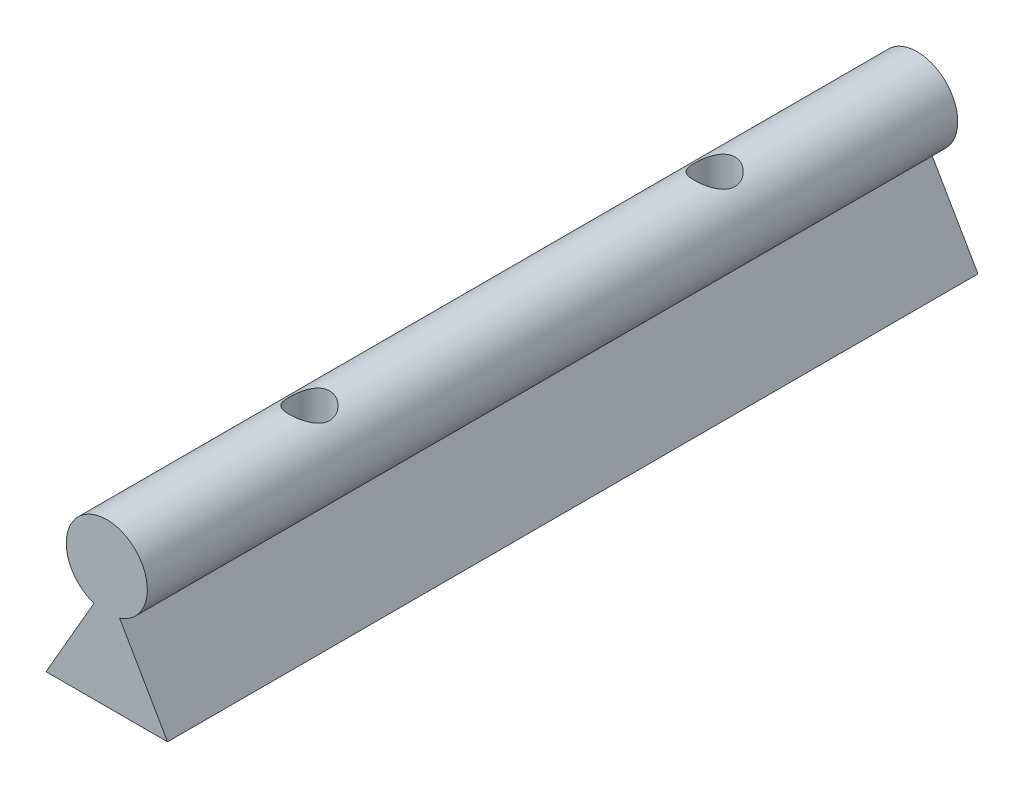
ISO-10303-21;
HEADER;
FILE_DESCRIPTION(('STEP AP214'),'2;1');
FILE_NAME('part.step','',(''),(''),'','','');
FILE_SCHEMA(('AUTOMOTIVE_DESIGN { 1 0 10303 214 1 1 1 1 }'));
ENDSEC;
DATA;
#1=APPLICATION_CONTEXT('core data for automotive mechanical design processes');
#2=APPLICATION_PROTOCOL_DEFINITION('international standard','automotive_design',2000,#1);
#3=PRODUCT_CONTEXT('',#1,'mechanical');
#4=PRODUCT('Part','Part','',(#3));
#5=PRODUCT_RELATED_PRODUCT_CATEGORY('part','',(#4));
#6=PRODUCT_DEFINITION_FORMATION('','',#4);
#7=PRODUCT_DEFINITION_CONTEXT('part definition',#1,'design');
#8=PRODUCT_DEFINITION('design','',#6,#7);
#9=PRODUCT_DEFINITION_SHAPE('','',#8);
#10=(LENGTH_UNIT() NAMED_UNIT(*) SI_UNIT(.MILLI.,.METRE.));
#11=(NAMED_UNIT(*) PLANE_ANGLE_UNIT() SI_UNIT($,.RADIAN.));
#12=(NAMED_UNIT(*) SI_UNIT($,.STERADIAN.) SOLID_ANGLE_UNIT());
#13=UNCERTAINTY_MEASURE_WITH_UNIT(LENGTH_MEASURE(1.E-05),#10,'distance_accuracy_value','');
#14=(GEOMETRIC_REPRESENTATION_CONTEXT(3) GLOBAL_UNCERTAINTY_ASSIGNED_CONTEXT((#13)) GLOBAL_UNIT_ASSIGNED_CONTEXT((#10,
#11,#12)) REPRESENTATION_CONTEXT('',''));
#15=CARTESIAN_POINT('',(0.,0.,0.));
#16=DIRECTION('',(0.,0.,1.));
#17=DIRECTION('',(1.,0.,0.));
#18=AXIS2_PLACEMENT_3D('',#15,#16,#17);
#19=CARTESIAN_POINT('',(0.,50.8,190.5));
#20=DIRECTION('',(0.,-1.,0.));
#21=DIRECTION('',(0.,0.,-1.));
#22=AXIS2_PLACEMENT_3D('',#19,#20,#21);
#23=CYLINDRICAL_SURFACE('',#22,3.3274);
#24=CARTESIAN_POINT('',(0.,0.,190.5));
#25=DIRECTION('',(0.,-1.,0.));
#26=DIRECTION('',(0.,0.,-1.));
#27=AXIS2_PLACEMENT_3D('',#24,#25,#26);
#28=CIRCLE('',#27,3.3274);
#29=CARTESIAN_POINT('',(0.,0.,187.1726));
#30=VERTEX_POINT('',#29);
#31=EDGE_CURVE('E107',#30,#30,#28,.T.);
#32=ORIENTED_EDGE('',*,*,#31,.T.);
#33=EDGE_LOOP('',(#32));
#34=FACE_BOUND('',#33,.T.);
#35=CARTESIAN_POINT('',(0.,38.1,190.5));
#36=DIRECTION('',(0.,1.,0.));
#37=DIRECTION('',(0.,0.,1.));
#38=AXIS2_PLACEMENT_3D('',#35,#36,#37);
#39=CIRCLE('',#38,3.3274);
#40=CARTESIAN_POINT('',(0.,38.1,193.8274));
#41=VERTEX_POINT('',#40);
#42=EDGE_CURVE('E123',#41,#41,#39,.F.);
#43=ORIENTED_EDGE('',*,*,#42,.F.);
#44=EDGE_LOOP('',(#43));
#45=FACE_BOUND('',#44,.T.);
#46=ADVANCED_FACE('F33',(#34,#45),#23,.F.);
#47=CARTESIAN_POINT('',(0.,50.8,63.5));
#48=DIRECTION('',(0.,-1.,0.));
#49=DIRECTION('',(0.,0.,-1.));
#50=AXIS2_PLACEMENT_3D('',#47,#48,#49);
#51=CYLINDRICAL_SURFACE('',#50,3.3274);
#52=CARTESIAN_POINT('',(0.,0.,63.5));
#53=DIRECTION('',(0.,-1.,0.));
#54=DIRECTION('',(0.,0.,-1.));
#55=AXIS2_PLACEMENT_3D('',#52,#53,#54);
#56=CIRCLE('',#55,3.3274);
#57=CARTESIAN_POINT('',(0.,0.,60.1726));
#58=VERTEX_POINT('',#57);
#59=EDGE_CURVE('E117',#58,#58,#56,.T.);
#60=ORIENTED_EDGE('',*,*,#59,.T.);
#61=EDGE_LOOP('',(#60));
#62=FACE_BOUND('',#61,.T.);
#63=CARTESIAN_POINT('',(0.,38.1,63.5));
#64=DIRECTION('',(0.,1.,0.));
#65=DIRECTION('',(0.,0.,1.));
#66=AXIS2_PLACEMENT_3D('',#63,#64,#65);
#67=CIRCLE('',#66,3.3274);
#68=CARTESIAN_POINT('',(0.,38.1,66.8274));
#69=VERTEX_POINT('',#68);
#70=EDGE_CURVE('E114',#69,#69,#67,.F.);
#71=ORIENTED_EDGE('',*,*,#70,.F.);
#72=EDGE_LOOP('',(#71));
#73=FACE_BOUND('',#72,.T.);
#74=ADVANCED_FACE('F134',(#62,#73),#51,.F.);
#75=CARTESIAN_POINT('',(4.0101700846188,26.0497495506347,254.));
#76=DIRECTION('',(-0.86602540378444,-0.499999999999998,0.));
#77=DIRECTION('',(0.499999999999998,-0.86602540378444,0.));
#78=AXIS2_PLACEMENT_3D('',#75,#76,#77);
#79=PLANE('',#78);
#80=DIRECTION('',(-0.499999999999998,0.86602540378444,0.));
#81=VECTOR('',#80,1.);
#82=CARTESIAN_POINT('',(4.0101700846188,26.0497495506347,0.));
#83=LINE('',#82,#81);
#84=CARTESIAN_POINT('',(19.05,0.,0.));
#85=VERTEX_POINT('',#84);
#86=CARTESIAN_POINT('',(4.01017008461879,26.0497495506347,0.));
#87=VERTEX_POINT('',#86);
#88=EDGE_CURVE('E104',#85,#87,#83,.T.);
#89=ORIENTED_EDGE('',*,*,#88,.T.);
#90=DIRECTION('',(0.,0.,-1.));
#91=VECTOR('',#90,1.);
#92=CARTESIAN_POINT('',(4.01017008461879,26.0497495506347,254.));
#93=LINE('',#92,#91);
#94=CARTESIAN_POINT('',(4.01017008461879,26.0497495506347,254.));
#95=VERTEX_POINT('',#94);
#96=EDGE_CURVE('E95',#95,#87,#93,.T.);
#97=ORIENTED_EDGE('',*,*,#96,.F.);
#98=DIRECTION('',(-0.499999999999998,0.86602540378444,0.));
#99=VECTOR('',#98,1.);
#100=CARTESIAN_POINT('',(4.0101700846188,26.0497495506347,254.));
#101=LINE('',#100,#99);
#102=CARTESIAN_POINT('',(19.05,0.,254.));
#103=VERTEX_POINT('',#102);
#104=EDGE_CURVE('E89',#103,#95,#101,.T.);
#105=ORIENTED_EDGE('',*,*,#104,.F.);
#106=DIRECTION('',(0.,0.,-1.));
#107=VECTOR('',#106,1.);
#108=CARTESIAN_POINT('',(19.05,0.,254.));
#109=LINE('',#108,#107);
#110=EDGE_CURVE('E100',#103,#85,#109,.T.);
#111=ORIENTED_EDGE('',*,*,#110,.T.);
#112=EDGE_LOOP('',(#89,#97,#105,#111));
#113=FACE_BOUND('',#112,.T.);
#114=ADVANCED_FACE('F35',(#113),#79,.F.);
#115=CARTESIAN_POINT('',(0.,38.1,254.));
#116=DIRECTION('',(0.,0.,-1.));
#117=DIRECTION('',(-1.,0.,0.));
#118=AXIS2_PLACEMENT_3D('',#115,#116,#117);
#119=CYLINDRICAL_SURFACE('',#118,12.7);
#120=CARTESIAN_POINT('',(0.,50.8,69.85));
#121=CARTESIAN_POINT('',(-0.166990879194913,50.7999994891774,69.8499994421759));
#122=CARTESIAN_POINT('',(-0.333993450198631,50.7966986728259,69.8434051711993));
#123=CARTESIAN_POINT('',(-0.666768526640045,50.7835786203218,69.8171033286682));
#124=CARTESIAN_POINT('',(-0.83254046522313,50.7737565484519,69.7973900524076));
#125=CARTESIAN_POINT('',(-1.16177467728404,50.7478292478082,69.7450462013111));
#126=CARTESIAN_POINT('',(-1.32523331106835,50.7317150589571,69.7123972048197));
#127=CARTESIAN_POINT('',(-1.64849348247789,50.6936085062318,69.6345436700231));
#128=CARTESIAN_POINT('',(-1.80829349634147,50.6716137398496,69.5893339997623));
#129=CARTESIAN_POINT('',(-2.12244180878878,50.6223959142721,69.4870611803294));
#130=CARTESIAN_POINT('',(-2.27681076158407,50.5951959650805,69.4300503379438));
#131=CARTESIAN_POINT('',(-2.57993454237572,50.5361502699189,69.3046002780589));
#132=CARTESIAN_POINT('',(-2.728687241851,50.5043027843762,69.2361567799233));
#133=CARTESIAN_POINT('',(-3.16512812193646,50.402881193969,69.0145916735138));
#134=CARTESIAN_POINT('',(-3.44334503957524,50.3273713354024,68.8451216410392));
#135=CARTESIAN_POINT('',(-3.98471796121714,50.1622186773861,68.4560574939862));
#136=CARTESIAN_POINT('',(-4.24594454614361,50.0719972312188,68.2340512417934));
#137=CARTESIAN_POINT('',(-4.72936553155195,49.8893960148839,67.7511481911964));
#138=CARTESIAN_POINT('',(-4.95153018780438,49.7970146601478,67.4902220337443));
#139=CARTESIAN_POINT('',(-5.25955398778228,49.6603243398217,67.0628248667093));
#140=CARTESIAN_POINT('',(-5.36106270491309,49.6134721485475,66.9082038937614));
#141=CARTESIAN_POINT('',(-5.55058368760464,49.5233099497228,66.5899476154752));
#142=CARTESIAN_POINT('',(-5.63860158329208,49.4799984680683,66.4263161094702));
#143=CARTESIAN_POINT('',(-5.800358082891,49.3984098057888,66.0909478644052));
#144=CARTESIAN_POINT('',(-5.87409762464252,49.3601322945723,65.9192116586054));
#145=CARTESIAN_POINT('',(-6.00645788836518,49.2900882100936,65.5688169432001));
#146=CARTESIAN_POINT('',(-6.06508754416236,49.2583177917589,65.3901625962078));
#147=CARTESIAN_POINT('',(-6.16347180761612,49.204259497995,65.0380237910296));
#148=CARTESIAN_POINT('',(-6.20414249112446,49.18151961136,64.8648649825109));
#149=CARTESIAN_POINT('',(-6.27089941680446,49.1438804844397,64.5149100900955));
#150=CARTESIAN_POINT('',(-6.29698628284911,49.1289809087597,64.3381141621246));
#151=CARTESIAN_POINT('',(-6.33415533919375,49.1076763086804,63.9825907052358));
#152=CARTESIAN_POINT('',(-6.34525022098375,49.1012640993807,63.8038649394043));
#153=CARTESIAN_POINT('',(-6.35229110757547,49.0972004886715,63.4460234576935));
#154=CARTESIAN_POINT('',(-6.34823855771192,49.0995482514047,63.2669077806485));
#155=CARTESIAN_POINT('',(-6.3264517713646,49.112090292946,62.9314176981249));
#156=CARTESIAN_POINT('',(-6.31041699475486,49.1213095833287,62.7748926401298));
#157=CARTESIAN_POINT('',(-6.26687134491478,49.146128374712,62.4639094653421));
#158=CARTESIAN_POINT('',(-6.23935668847135,49.1617299789813,62.3094520472784));
#159=CARTESIAN_POINT('',(-6.17316873448516,49.1988027904553,62.003688703298));
#160=CARTESIAN_POINT('',(-6.13449690187385,49.220273227066,61.8523823664405));
#161=CARTESIAN_POINT('',(-6.04639785576759,49.2684190383084,61.5537613579966));
#162=CARTESIAN_POINT('',(-5.99696641549924,49.2950964580098,61.4064482807581));
#163=CARTESIAN_POINT('',(-5.8306799991241,49.383137611808,60.9650712730653));
#164=CARTESIAN_POINT('',(-5.69733157989732,49.451625656313,60.6784494378061));
#165=CARTESIAN_POINT('',(-5.3913988058265,49.600071400071,60.1304231498828));
#166=CARTESIAN_POINT('',(-5.21879682720645,49.6800342452273,59.86903009957));
#167=CARTESIAN_POINT('',(-4.8137371630742,49.8546812882033,59.3438125690412));
#168=CARTESIAN_POINT('',(-4.57646495884519,49.9499465086129,59.0838823296491));
#169=CARTESIAN_POINT('',(-4.06112275052906,50.1362854764244,58.6057965991381));
#170=CARTESIAN_POINT('',(-3.78303336001451,50.2273572049436,58.3876610728588));
#171=CARTESIAN_POINT('',(-3.33286643739692,50.3559388572571,58.0917786254828));
#172=CARTESIAN_POINT('',(-3.17335722609786,50.3983050254296,57.9966401532776));
#173=CARTESIAN_POINT('',(-2.84569771626433,50.4782218301755,57.8202932887563));
#174=CARTESIAN_POINT('',(-2.67755134695857,50.5157746297482,57.7390786338707));
#175=CARTESIAN_POINT('',(-2.33378760343926,50.584957929256,57.5914534288931));
#176=CARTESIAN_POINT('',(-2.15817316355133,50.6165907293456,57.5250371271344));
#177=CARTESIAN_POINT('',(-1.80074808519262,50.6729876360055,57.4077783400175));
#178=CARTESIAN_POINT('',(-1.61893816219397,50.6977525327026,57.3569340630848));
#179=CARTESIAN_POINT('',(-1.26593635485423,50.7378915597613,57.2750530402545));
#180=CARTESIAN_POINT('',(-1.09511243698781,50.7538736459652,57.2427244136913));
#181=CARTESIAN_POINT('',(-0.750891318848385,50.7789562420375,57.1921544116368));
#182=CARTESIAN_POINT('',(-0.577494259066498,50.7880571262137,57.1739122699002));
#183=CARTESIAN_POINT('',(-0.229629611373367,50.7991158370576,57.1517612761007));
#184=CARTESIAN_POINT('',(-0.0551624794535124,50.8010765197081,57.1478466932071));
#185=CARTESIAN_POINT('',(0.293430507417622,50.7978059034872,57.1543886079494));
#186=CARTESIAN_POINT('',(0.467556377130888,50.7925749229034,57.1648444695801));
#187=CARTESIAN_POINT('',(0.800509536744126,50.7757555094506,57.1986136315206));
#188=CARTESIAN_POINT('',(0.959472887164202,50.7646934781011,57.2208630740019));
#189=CARTESIAN_POINT('',(1.27482840052135,50.7368459564446,57.2772211624817));
#190=CARTESIAN_POINT('',(1.43121967166004,50.7200585231077,57.3113338345825));
#191=CARTESIAN_POINT('',(1.74030776864044,50.681159973299,57.391047952959));
#192=CARTESIAN_POINT('',(1.89300576133391,50.6590505630801,57.4366457172722));
#193=CARTESIAN_POINT('',(2.19390570072539,50.6099971792976,57.5389143910584));
#194=CARTESIAN_POINT('',(2.34210587161409,50.5830513245292,57.5955896100324));
#195=CARTESIAN_POINT('',(2.63725856238895,50.5240951779885,57.7212622939719));
#196=CARTESIAN_POINT('',(2.78405822350627,50.4919635638501,57.7905620050969));
#197=CARTESIAN_POINT('',(3.07126756713201,50.42392525103,57.9397813940777));
#198=CARTESIAN_POINT('',(3.21167506178127,50.3880172735192,58.0197046719357));
#199=CARTESIAN_POINT('',(3.62227376445693,50.2757741292216,58.2745491136814));
#200=CARTESIAN_POINT('',(3.88199540128414,50.1948877082824,58.4646110787881));
#201=CARTESIAN_POINT('',(4.39279994151149,50.0194499483036,58.9011398441674));
#202=CARTESIAN_POINT('',(4.64052990372704,49.9243367236915,59.1513128051332));
#203=CARTESIAN_POINT('',(4.97892395439653,49.7839772811164,59.5549100898515));
#204=CARTESIAN_POINT('',(5.08625380253179,49.7375432562751,59.6942761051402));
#205=CARTESIAN_POINT('',(5.28929908879012,49.6466734049483,59.981933742679));
#206=CARTESIAN_POINT('',(5.38501278922798,49.6022378780468,60.1302266953779));
#207=CARTESIAN_POINT('',(5.56849389071529,49.5145838039712,60.4424281006111));
#208=CARTESIAN_POINT('',(5.65564549590481,49.4715304916549,60.6067454440509));
#209=CARTESIAN_POINT('',(5.81556909376685,49.390579644901,60.9433705339));
#210=CARTESIAN_POINT('',(5.88834801781487,49.3526796279935,61.115674378989));
#211=CARTESIAN_POINT('',(6.01870593214499,49.2834979926119,61.4670791641593));
#212=CARTESIAN_POINT('',(6.07629712370978,49.2522110654534,61.6461745150594));
#213=CARTESIAN_POINT('',(6.17556605056232,49.1975495796607,62.0098983380202));
#214=CARTESIAN_POINT('',(6.21724624980149,49.1741737959829,62.1945259485842));
#215=CARTESIAN_POINT('',(6.28083303239847,49.138221566145,62.5497382585254));
#216=CARTESIAN_POINT('',(6.30425367574495,49.1248238589961,62.719969699185));
#217=CARTESIAN_POINT('',(6.3372218674544,49.1059068618668,63.0622059736914));
#218=CARTESIAN_POINT('',(6.34677035930017,49.1003870360907,63.2342106861318));
#219=CARTESIAN_POINT('',(6.35184755649862,49.0974561088362,63.5784312834341));
#220=CARTESIAN_POINT('',(6.34738144738999,49.1000420081603,63.7506470666262));
#221=CARTESIAN_POINT('',(6.32451076696089,49.1132073594892,64.0938336660463));
#222=CARTESIAN_POINT('',(6.30610676625142,49.1237864842549,64.2648045329513));
#223=CARTESIAN_POINT('',(6.25804920718464,49.1511312712702,64.5878296898959));
#224=CARTESIAN_POINT('',(6.22963986719983,49.1672085028909,64.7401293180212));
#225=CARTESIAN_POINT('',(6.16196939123338,49.2050268373618,65.0416003606676));
#226=CARTESIAN_POINT('',(6.1227046522252,49.2267698205995,65.1907707188327));
#227=CARTESIAN_POINT('',(5.98919755549729,49.2995485940621,65.6322243315878));
#228=CARTESIAN_POINT('',(5.87921095671374,49.3581531108883,65.9186570190924));
#229=CARTESIAN_POINT('',(5.61221709335548,49.4937155944896,66.4885160055318));
#230=CARTESIAN_POINT('',(5.45254719309571,49.5716421113511,66.7704473974524));
#231=CARTESIAN_POINT('',(5.09367320950779,49.735439817654,67.3053730733708));
#232=CARTESIAN_POINT('',(4.89444855823949,49.8213151279082,67.5583521942334));
#233=CARTESIAN_POINT('',(4.43354035272873,50.0038699110716,68.0602382551382));
#234=CARTESIAN_POINT('',(4.16720894914421,50.1005943076297,68.3049154327347));
#235=CARTESIAN_POINT('',(3.73813634318358,50.2383310810892,68.6363060499741));
#236=CARTESIAN_POINT('',(3.5900456973254,50.2830529217553,68.7409050919539));
#237=CARTESIAN_POINT('',(3.28473589884859,50.3688872478125,68.9374551775996));
#238=CARTESIAN_POINT('',(3.12752095014408,50.4100013738234,69.0294119812597));
#239=CARTESIAN_POINT('',(2.80361177397837,50.4878055405892,69.2005331085148));
#240=CARTESIAN_POINT('',(2.63685404738456,50.5244591999769,69.2795938199596));
#241=CARTESIAN_POINT('',(2.29614399762541,50.5919115290982,69.4232062854184));
#242=CARTESIAN_POINT('',(2.12219525894013,50.6227130740716,69.4877651672765));
#243=CARTESIAN_POINT('',(1.76872534139741,50.6775008101552,69.6015167403403));
#244=CARTESIAN_POINT('',(1.58921727277205,50.7015018553988,69.6507429460023));
#245=CARTESIAN_POINT('',(1.22585054083135,50.742019952057,69.7333352690337));
#246=CARTESIAN_POINT('',(1.04199460738348,50.7585415748002,69.7667110745812));
#247=CARTESIAN_POINT('',(0.7150630286539,50.7806500718221,69.8112325619244));
#248=CARTESIAN_POINT('',(0.572548812651056,50.7878936037074,69.825757901848));
#249=CARTESIAN_POINT('',(0.286692618188958,50.7975688534566,69.8451419937193));
#250=CARTESIAN_POINT('',(0.143350616991764,50.8000004385074,69.8500004788551));
#251=CARTESIAN_POINT('',(0.,50.8,69.85));
#252=B_SPLINE_CURVE_WITH_KNOTS('',3,(#120,#121,#122,#123,#124,#125,#126,#127,#128,#129,#130,
#131,#132,#133,#134,#135,#136,#137,#138,#139,#140,#141,#142,#143,#144,#145,#146,#147,#148,#149,
#150,#151,#152,#153,#154,#155,#156,#157,#158,#159,#160,#161,#162,#163,#164,#165,#166,#167,#168,
#169,#170,#171,#172,#173,#174,#175,#176,#177,#178,#179,#180,#181,#182,#183,#184,#185,#186,#187,
#188,#189,#190,#191,#192,#193,#194,#195,#196,#197,#198,#199,#200,#201,#202,#203,#204,#205,#206,
#207,#208,#209,#210,#211,#212,#213,#214,#215,#216,#217,#218,#219,#220,#221,#222,#223,#224,#225,
#226,#227,#228,#229,#230,#231,#232,#233,#234,#235,#236,#237,#238,#239,#240,#241,#242,#243,#244,
#245,#246,#247,#248,#249,#250,#251),.UNSPECIFIED.,.T.,.F.,(4,2,2,2,2,2,2,2,2,2,2,2,2,2,2,2,2,2,
2,2,2,2,2,2,2,2,2,2,2,2,2,2,2,2,2,2,2,2,2,2,2,2,2,2,2,2,2,2,2,2,2,2,2,2,2,2,2,2,2,2,2,2,2,2,2,
4),(0.,0.50083122420536,1.00188037372803,1.5036456429069,2.0056162222071,2.50540779268628,
3.0053869172507,4.00425210956756,5.06354639773447,6.12364383897773,6.69546056113473,
7.26703799333407,7.83857787007117,8.4097790405316,8.94696617231635,9.48413032231425,
10.020839449589,10.5574973665628,11.0297819407841,11.5022222802449,11.9746006167424,
12.447164856978,13.4133450583963,14.3799599077215,15.4691385823987,16.558836254714,
17.1296896955319,17.7002857039293,18.2706595507726,18.8409677509571,19.3640345307036,
19.8870728558157,20.4099019497636,20.9327079051584,21.4148301207384,21.8971161172382,
22.3792476958438,22.8615672144633,23.3574791185916,23.8535595025871,24.8452132673351,
25.9342484207189,26.4795520760265,27.0249372042286,27.5969396508645,28.1686655660688,
28.7399307681394,29.3111074690516,29.8274552059119,30.3437678229116,30.8598894217494,
31.3759898919437,31.8427315926275,32.3096283963947,33.2427989036526,34.2386648311406,
35.2350499582129,36.3525027406484,36.9121724680045,37.4715863502977,38.0352942497766,
38.5987244700203,39.1609143479984,39.7227601571806,40.1526787482413,40.5826092051903),.UNSPECIFIED.);
#253=CARTESIAN_POINT('',(0.,50.8,69.85));
#254=VERTEX_POINT('',#253);
#255=EDGE_CURVE('E45',#254,#254,#252,.T.);
#256=ORIENTED_EDGE('',*,*,#255,.T.);
#257=EDGE_LOOP('',(#256));
#258=FACE_BOUND('',#257,.T.);
#259=CARTESIAN_POINT('',(0.,50.8,196.85));
#260=CARTESIAN_POINT('',(-0.166990879194914,50.7999994891774,196.849999442176));
#261=CARTESIAN_POINT('',(-0.333993450198632,50.7966986728259,196.843405171199));
#262=CARTESIAN_POINT('',(-0.666768526640045,50.7835786203218,196.817103328668));
#263=CARTESIAN_POINT('',(-0.83254046522313,50.7737565484519,196.797390052408));
#264=CARTESIAN_POINT('',(-1.16177467728404,50.7478292478082,196.745046201311));
#265=CARTESIAN_POINT('',(-1.32523331106835,50.7317150589571,196.71239720482));
#266=CARTESIAN_POINT('',(-1.64849348247789,50.6936085062318,196.634543670023));
#267=CARTESIAN_POINT('',(-1.80829349634147,50.6716137398496,196.589333999762));
#268=CARTESIAN_POINT('',(-2.12244180878878,50.6223959142721,196.487061180329));
#269=CARTESIAN_POINT('',(-2.27681076158406,50.5951959650805,196.430050337944));
#270=CARTESIAN_POINT('',(-2.57993454237572,50.5361502699189,196.304600278059));
#271=CARTESIAN_POINT('',(-2.728687241851,50.5043027843762,196.236156779923));
#272=CARTESIAN_POINT('',(-3.16512812193646,50.402881193969,196.014591673514));
#273=CARTESIAN_POINT('',(-3.44334503957524,50.3273713354024,195.845121641039));
#274=CARTESIAN_POINT('',(-3.98471796121714,50.1622186773861,195.456057493986));
#275=CARTESIAN_POINT('',(-4.24594454614362,50.0719972312188,195.234051241793));
#276=CARTESIAN_POINT('',(-4.72936553155196,49.8893960148839,194.751148191196));
#277=CARTESIAN_POINT('',(-4.95153018780438,49.7970146601478,194.490222033744));
#278=CARTESIAN_POINT('',(-5.25955398778229,49.6603243398217,194.062824866709));
#279=CARTESIAN_POINT('',(-5.3610627049131,49.6134721485475,193.908203893761));
#280=CARTESIAN_POINT('',(-5.55058368760465,49.5233099497228,193.589947615475));
#281=CARTESIAN_POINT('',(-5.63860158329209,49.4799984680683,193.42631610947));
#282=CARTESIAN_POINT('',(-5.80035808289101,49.3984098057888,193.090947864405));
#283=CARTESIAN_POINT('',(-5.87409762464253,49.3601322945723,192.919211658605));
#284=CARTESIAN_POINT('',(-6.00645788836519,49.2900882100936,192.5688169432));
#285=CARTESIAN_POINT('',(-6.06508754416237,49.2583177917589,192.390162596208));
#286=CARTESIAN_POINT('',(-6.16347180761613,49.204259497995,192.03802379103));
#287=CARTESIAN_POINT('',(-6.20414249112446,49.18151961136,191.864864982511));
#288=CARTESIAN_POINT('',(-6.27089941680447,49.1438804844397,191.514910090096));
#289=CARTESIAN_POINT('',(-6.29698628284912,49.1289809087597,191.338114162125));
#290=CARTESIAN_POINT('',(-6.33415533919377,49.1076763086804,190.982590705236));
#291=CARTESIAN_POINT('',(-6.34525022098376,49.1012640993806,190.803864939404));
#292=CARTESIAN_POINT('',(-6.35229110757549,49.0972004886715,190.446023457694));
#293=CARTESIAN_POINT('',(-6.34823855771194,49.0995482514047,190.266907780648));
#294=CARTESIAN_POINT('',(-6.32645177136462,49.112090292946,189.931417698125));
#295=CARTESIAN_POINT('',(-6.31041699475488,49.1213095833287,189.77489264013));
#296=CARTESIAN_POINT('',(-6.26687134491479,49.146128374712,189.463909465342));
#297=CARTESIAN_POINT('',(-6.23935668847136,49.1617299789813,189.309452047278));
#298=CARTESIAN_POINT('',(-6.17316873448519,49.1988027904553,189.003688703298));
#299=CARTESIAN_POINT('',(-6.13449690187387,49.220273227066,188.852382366441));
#300=CARTESIAN_POINT('',(-6.04639785576762,49.2684190383084,188.553761357997));
#301=CARTESIAN_POINT('',(-5.99696641549926,49.2950964580098,188.406448280758));
#302=CARTESIAN_POINT('',(-5.83067999912411,49.3831376118079,187.965071273065));
#303=CARTESIAN_POINT('',(-5.69733157989734,49.451625656313,187.678449437806));
#304=CARTESIAN_POINT('',(-5.39139880582652,49.600071400071,187.130423149883));
#305=CARTESIAN_POINT('',(-5.21879682720648,49.6800342452273,186.86903009957));
#306=CARTESIAN_POINT('',(-4.81373716307422,49.8546812882033,186.343812569041));
#307=CARTESIAN_POINT('',(-4.57646495884521,49.9499465086129,186.083882329649));
#308=CARTESIAN_POINT('',(-4.06112275052909,50.1362854764244,185.605796599138));
#309=CARTESIAN_POINT('',(-3.78303336001455,50.2273572049436,185.387661072859));
#310=CARTESIAN_POINT('',(-3.33286643739696,50.355938857257,185.091778625483));
#311=CARTESIAN_POINT('',(-3.17335722609791,50.3983050254296,184.996640153278));
#312=CARTESIAN_POINT('',(-2.84569771626438,50.4782218301755,184.820293288756));
#313=CARTESIAN_POINT('',(-2.67755134695861,50.5157746297482,184.739078633871));
#314=CARTESIAN_POINT('',(-2.3337876034393,50.5849579292559,184.591453428893));
#315=CARTESIAN_POINT('',(-2.15817316355137,50.6165907293456,184.525037127134));
#316=CARTESIAN_POINT('',(-1.80074808519266,50.6729876360055,184.407778340018));
#317=CARTESIAN_POINT('',(-1.618938162194,50.6977525327026,184.356934063085));
#318=CARTESIAN_POINT('',(-1.26593635485427,50.7378915597613,184.275053040255));
#319=CARTESIAN_POINT('',(-1.09511243698784,50.7538736459652,184.242724413691));
#320=CARTESIAN_POINT('',(-0.750891318848415,50.7789562420375,184.192154411637));
#321=CARTESIAN_POINT('',(-0.577494259066528,50.7880571262137,184.1739122699));
#322=CARTESIAN_POINT('',(-0.229629611373397,50.7991158370576,184.151761276101));
#323=CARTESIAN_POINT('',(-0.0551624794535421,50.8010765197081,184.147846693207));
#324=CARTESIAN_POINT('',(0.293430507417592,50.7978059034872,184.154388607949));
#325=CARTESIAN_POINT('',(0.467556377130857,50.7925749229034,184.16484446958));
#326=CARTESIAN_POINT('',(0.800509536744092,50.7757555094506,184.198613631521));
#327=CARTESIAN_POINT('',(0.959472887164168,50.7646934781011,184.220863074002));
#328=CARTESIAN_POINT('',(1.27482840052132,50.7368459564446,184.277221162482));
#329=CARTESIAN_POINT('',(1.43121967166001,50.7200585231077,184.311333834583));
#330=CARTESIAN_POINT('',(1.74030776864041,50.681159973299,184.391047952959));
#331=CARTESIAN_POINT('',(1.89300576133387,50.6590505630802,184.436645717272));
#332=CARTESIAN_POINT('',(2.19390570072536,50.6099971792976,184.538914391058));
#333=CARTESIAN_POINT('',(2.34210587161405,50.5830513245292,184.595589610032));
#334=CARTESIAN_POINT('',(2.63725856238892,50.5240951779885,184.721262293972));
#335=CARTESIAN_POINT('',(2.78405822350623,50.4919635638501,184.790562005097));
#336=CARTESIAN_POINT('',(3.07126756713197,50.42392525103,184.939781394078));
#337=CARTESIAN_POINT('',(3.21167506178123,50.3880172735192,185.019704671936));
#338=CARTESIAN_POINT('',(3.6222737644569,50.2757741292216,185.274549113681));
#339=CARTESIAN_POINT('',(3.8819954012841,50.1948877082824,185.464611078788));
#340=CARTESIAN_POINT('',(4.39279994151146,50.0194499483036,185.901139844167));
#341=CARTESIAN_POINT('',(4.64052990372701,49.9243367236915,186.151312805133));
#342=CARTESIAN_POINT('',(4.97892395439652,49.7839772811164,186.554910089852));
#343=CARTESIAN_POINT('',(5.08625380253178,49.7375432562751,186.69427610514));
#344=CARTESIAN_POINT('',(5.2892990887901,49.6466734049483,186.981933742679));
#345=CARTESIAN_POINT('',(5.38501278922796,49.6022378780468,187.130226695378));
#346=CARTESIAN_POINT('',(5.56849389071525,49.5145838039713,187.442428100611));
#347=CARTESIAN_POINT('',(5.65564549590477,49.4715304916549,187.606745444051));
#348=CARTESIAN_POINT('',(5.81556909376682,49.390579644901,187.9433705339));
#349=CARTESIAN_POINT('',(5.88834801781484,49.3526796279935,188.115674378989));
#350=CARTESIAN_POINT('',(6.01870593214496,49.2834979926119,188.467079164159));
#351=CARTESIAN_POINT('',(6.07629712370975,49.2522110654534,188.646174515059));
#352=CARTESIAN_POINT('',(6.1755660505623,49.1975495796607,189.00989833802));
#353=CARTESIAN_POINT('',(6.21724624980147,49.1741737959829,189.194525948584));
#354=CARTESIAN_POINT('',(6.28083303239845,49.138221566145,189.549738258525));
#355=CARTESIAN_POINT('',(6.30425367574493,49.1248238589961,189.719969699185));
#356=CARTESIAN_POINT('',(6.33722186745438,49.1059068618669,190.062205973691));
#357=CARTESIAN_POINT('',(6.34677035930015,49.1003870360907,190.234210686132));
#358=CARTESIAN_POINT('',(6.3518475564986,49.0974561088362,190.578431283434));
#359=CARTESIAN_POINT('',(6.34738144738997,49.1000420081603,190.750647066626));
#360=CARTESIAN_POINT('',(6.32451076696087,49.1132073594892,191.093833666046));
#361=CARTESIAN_POINT('',(6.3061067662514,49.123786484255,191.264804532951));
#362=CARTESIAN_POINT('',(6.25804920718462,49.1511312712702,191.587829689896));
#363=CARTESIAN_POINT('',(6.22963986719981,49.1672085028909,191.740129318021));
#364=CARTESIAN_POINT('',(6.16196939123336,49.2050268373618,192.041600360668));
#365=CARTESIAN_POINT('',(6.12270465222518,49.2267698205995,192.190770718833));
#366=CARTESIAN_POINT('',(5.98919755549726,49.2995485940621,192.632224331588));
#367=CARTESIAN_POINT('',(5.87921095671372,49.3581531108883,192.918657019092));
#368=CARTESIAN_POINT('',(5.61221709335546,49.4937155944897,193.488516005532));
#369=CARTESIAN_POINT('',(5.45254719309568,49.5716421113511,193.770447397452));
#370=CARTESIAN_POINT('',(5.09367320950776,49.735439817654,194.305373073371));
#371=CARTESIAN_POINT('',(4.89444855823946,49.8213151279082,194.558352194233));
#372=CARTESIAN_POINT('',(4.43354035272871,50.0038699110716,195.060238255138));
#373=CARTESIAN_POINT('',(4.1672089491442,50.1005943076297,195.304915432735));
#374=CARTESIAN_POINT('',(3.73813634318358,50.2383310810892,195.636306049974));
#375=CARTESIAN_POINT('',(3.5900456973254,50.2830529217553,195.740905091954));
#376=CARTESIAN_POINT('',(3.28473589884858,50.3688872478125,195.9374551776));
#377=CARTESIAN_POINT('',(3.12752095014406,50.4100013738234,196.02941198126));
#378=CARTESIAN_POINT('',(2.80361177397835,50.4878055405892,196.200533108515));
#379=CARTESIAN_POINT('',(2.63685404738455,50.5244591999769,196.27959381996));
#380=CARTESIAN_POINT('',(2.2961439976254,50.5919115290982,196.423206285418));
#381=CARTESIAN_POINT('',(2.12219525894012,50.6227130740716,196.487765167276));
#382=CARTESIAN_POINT('',(1.76872534139741,50.6775008101552,196.60151674034));
#383=CARTESIAN_POINT('',(1.58921727277205,50.7015018553988,196.650742946002));
#384=CARTESIAN_POINT('',(1.22585054083136,50.742019952057,196.733335269034));
#385=CARTESIAN_POINT('',(1.04199460738348,50.7585415748002,196.766711074581));
#386=CARTESIAN_POINT('',(0.715063028653906,50.7806500718221,196.811232561924));
#387=CARTESIAN_POINT('',(0.572548812651062,50.7878936037074,196.825757901848));
#388=CARTESIAN_POINT('',(0.286692618188961,50.7975688534566,196.845141993719));
#389=CARTESIAN_POINT('',(0.143350616991765,50.8000004385074,196.850000478855));
#390=CARTESIAN_POINT('',(0.,50.8,196.85));
#391=B_SPLINE_CURVE_WITH_KNOTS('',3,(#259,#260,#261,#262,#263,#264,#265,#266,#267,#268,#269,
#270,#271,#272,#273,#274,#275,#276,#277,#278,#279,#280,#281,#282,#283,#284,#285,#286,#287,#288,
#289,#290,#291,#292,#293,#294,#295,#296,#297,#298,#299,#300,#301,#302,#303,#304,#305,#306,#307,
#308,#309,#310,#311,#312,#313,#314,#315,#316,#317,#318,#319,#320,#321,#322,#323,#324,#325,#326,
#327,#328,#329,#330,#331,#332,#333,#334,#335,#336,#337,#338,#339,#340,#341,#342,#343,#344,#345,
#346,#347,#348,#349,#350,#351,#352,#353,#354,#355,#356,#357,#358,#359,#360,#361,#362,#363,#364,
#365,#366,#367,#368,#369,#370,#371,#372,#373,#374,#375,#376,#377,#378,#379,#380,#381,#382,#383,
#384,#385,#386,#387,#388,#389,#390),.UNSPECIFIED.,.T.,.F.,(4,2,2,2,2,2,2,2,2,2,2,2,2,2,2,2,2,2,
2,2,2,2,2,2,2,2,2,2,2,2,2,2,2,2,2,2,2,2,2,2,2,2,2,2,2,2,2,2,2,2,2,2,2,2,2,2,2,2,2,2,2,2,2,2,2,
4),(0.,0.50083122420536,1.00188037372803,1.5036456429069,2.0056162222071,2.50540779268628,
3.0053869172507,4.00425210956756,5.06354639773448,6.12364383897774,6.69546056113471,
7.26703799333407,7.83857787007116,8.4097790405316,8.9469661723163,9.48413032231426,
10.020839449589,10.5574973665628,11.0297819407841,11.5022222802449,11.9746006167424,
12.447164856978,13.4133450583963,14.3799599077215,15.4691385823987,16.558836254714,
17.1296896955319,17.7002857039293,18.2706595507726,18.8409677509571,19.3640345307036,
19.8870728558157,20.4099019497636,20.9327079051584,21.4148301207384,21.8971161172382,
22.3792476958437,22.8615672144633,23.3574791185916,23.8535595025871,24.8452132673351,
25.9342484207189,26.4795520760265,27.0249372042285,27.5969396508644,28.1686655660688,
28.7399307681394,29.3111074690516,29.8274552059118,30.3437678229116,30.8598894217494,
31.3759898919437,31.8427315926276,32.3096283963947,33.2427989036526,34.2386648311406,
35.2350499582129,36.3525027406484,36.9121724680044,37.4715863502977,38.0352942497766,
38.5987244700203,39.1609143479984,39.7227601571806,40.1526787482413,40.5826092051903),.UNSPECIFIED.);
#392=CARTESIAN_POINT('',(0.,50.8,196.85));
#393=VERTEX_POINT('',#392);
#394=EDGE_CURVE('E11',#393,#393,#391,.T.);
#395=ORIENTED_EDGE('',*,*,#394,.T.);
#396=EDGE_LOOP('',(#395));
#397=FACE_BOUND('',#396,.T.);
#398=CARTESIAN_POINT('',(0.,38.1,0.));
#399=DIRECTION('',(0.,0.,1.));
#400=DIRECTION('',(1.,0.,0.));
#401=AXIS2_PLACEMENT_3D('',#398,#399,#400);
#402=CIRCLE('',#401,12.7);
#403=CARTESIAN_POINT('',(-4.01017008461881,26.0497495506347,0.));
#404=VERTEX_POINT('',#403);
#405=EDGE_CURVE('E94',#87,#404,#402,.T.);
#406=ORIENTED_EDGE('',*,*,#405,.T.);
#407=DIRECTION('',(0.,0.,-1.));
#408=VECTOR('',#407,1.);
#409=CARTESIAN_POINT('',(-4.01017008461881,26.0497495506347,254.));
#410=LINE('',#409,#408);
#411=CARTESIAN_POINT('',(-4.01017008461881,26.0497495506347,254.));
#412=VERTEX_POINT('',#411);
#413=EDGE_CURVE('E92',#412,#404,#410,.T.);
#414=ORIENTED_EDGE('',*,*,#413,.F.);
#415=CARTESIAN_POINT('',(0.,38.1,254.));
#416=DIRECTION('',(0.,0.,1.));
#417=DIRECTION('',(1.,0.,0.));
#418=AXIS2_PLACEMENT_3D('',#415,#416,#417);
#419=CIRCLE('',#418,12.7);
#420=EDGE_CURVE('E84',#95,#412,#419,.T.);
#421=ORIENTED_EDGE('',*,*,#420,.F.);
#422=ORIENTED_EDGE('',*,*,#96,.T.);
#423=EDGE_LOOP('',(#406,#414,#421,#422));
#424=FACE_BOUND('',#423,.T.);
#425=ADVANCED_FACE('F93',(#258,#397,#424),#119,.T.);
#426=CARTESIAN_POINT('',(-19.05,0.,254.));
#427=DIRECTION('',(0.86602540378444,-0.499999999999998,0.));
#428=DIRECTION('',(0.499999999999998,0.86602540378444,0.));
#429=AXIS2_PLACEMENT_3D('',#426,#427,#428);
#430=PLANE('',#429);
#431=DIRECTION('',(-0.499999999999998,-0.86602540378444,0.));
#432=VECTOR('',#431,1.);
#433=CARTESIAN_POINT('',(-19.05,0.,0.));
#434=LINE('',#433,#432);
#435=CARTESIAN_POINT('',(-19.05,0.,0.));
#436=VERTEX_POINT('',#435);
#437=EDGE_CURVE('E70',#404,#436,#434,.T.);
#438=ORIENTED_EDGE('',*,*,#437,.T.);
#439=DIRECTION('',(0.,0.,-1.));
#440=VECTOR('',#439,1.);
#441=CARTESIAN_POINT('',(-19.05,0.,254.));
#442=LINE('',#441,#440);
#443=CARTESIAN_POINT('',(-19.05,0.,254.));
#444=VERTEX_POINT('',#443);
#445=EDGE_CURVE('E96',#444,#436,#442,.T.);
#446=ORIENTED_EDGE('',*,*,#445,.F.);
#447=DIRECTION('',(-0.499999999999998,-0.86602540378444,0.));
#448=VECTOR('',#447,1.);
#449=CARTESIAN_POINT('',(-19.05,0.,254.));
#450=LINE('',#449,#448);
#451=EDGE_CURVE('E87',#412,#444,#450,.T.);
#452=ORIENTED_EDGE('',*,*,#451,.F.);
#453=ORIENTED_EDGE('',*,*,#413,.T.);
#454=EDGE_LOOP('',(#438,#446,#452,#453));
#455=FACE_BOUND('',#454,.T.);
#456=ADVANCED_FACE('F98',(#455),#430,.F.);
#457=CARTESIAN_POINT('',(-19.05,0.,254.));
#458=DIRECTION('',(0.,1.,0.));
#459=DIRECTION('',(0.,0.,1.));
#460=AXIS2_PLACEMENT_3D('',#457,#458,#459);
#461=PLANE('',#460);
#462=ORIENTED_EDGE('',*,*,#59,.F.);
#463=EDGE_LOOP('',(#462));
#464=FACE_BOUND('',#463,.T.);
#465=ORIENTED_EDGE('',*,*,#31,.F.);
#466=EDGE_LOOP('',(#465));
#467=FACE_BOUND('',#466,.T.);
#468=DIRECTION('',(1.,0.,0.));
#469=VECTOR('',#468,1.);
#470=CARTESIAN_POINT('',(-19.05,0.,0.));
#471=LINE('',#470,#469);
#472=EDGE_CURVE('E76',#436,#85,#471,.T.);
#473=ORIENTED_EDGE('',*,*,#472,.T.);
#474=ORIENTED_EDGE('',*,*,#110,.F.);
#475=DIRECTION('',(1.,0.,0.));
#476=VECTOR('',#475,1.);
#477=CARTESIAN_POINT('',(-19.05,0.,254.));
#478=LINE('',#477,#476);
#479=EDGE_CURVE('E53',#444,#103,#478,.T.);
#480=ORIENTED_EDGE('',*,*,#479,.F.);
#481=ORIENTED_EDGE('',*,*,#445,.T.);
#482=EDGE_LOOP('',(#473,#474,#480,#481));
#483=FACE_BOUND('',#482,.T.);
#484=ADVANCED_FACE('F143',(#464,#467,#483),#461,.F.);
#485=CARTESIAN_POINT('',(0.,38.1,254.));
#486=DIRECTION('',(0.,0.,1.));
#487=DIRECTION('',(1.,0.,0.));
#488=AXIS2_PLACEMENT_3D('',#485,#486,#487);
#489=PLANE('',#488);
#490=ORIENTED_EDGE('',*,*,#104,.T.);
#491=ORIENTED_EDGE('',*,*,#420,.T.);
#492=ORIENTED_EDGE('',*,*,#451,.T.);
#493=ORIENTED_EDGE('',*,*,#479,.T.);
#494=EDGE_LOOP('',(#490,#491,#492,#493));
#495=FACE_BOUND('',#494,.T.);
#496=ADVANCED_FACE('F85',(#495),#489,.T.);
#497=CARTESIAN_POINT('',(0.,38.1,0.));
#498=DIRECTION('',(0.,0.,1.));
#499=DIRECTION('',(1.,0.,0.));
#500=AXIS2_PLACEMENT_3D('',#497,#498,#499);
#501=PLANE('',#500);
#502=ORIENTED_EDGE('',*,*,#88,.F.);
#503=ORIENTED_EDGE('',*,*,#472,.F.);
#504=ORIENTED_EDGE('',*,*,#437,.F.);
#505=ORIENTED_EDGE('',*,*,#405,.F.);
#506=EDGE_LOOP('',(#502,#503,#504,#505));
#507=FACE_BOUND('',#506,.T.);
#508=ADVANCED_FACE('F132',(#507),#501,.F.);
#509=CARTESIAN_POINT('',(0.,38.1,63.5));
#510=DIRECTION('',(0.,1.,0.));
#511=DIRECTION('',(0.,0.,1.));
#512=AXIS2_PLACEMENT_3D('',#509,#510,#511);
#513=CYLINDRICAL_SURFACE('',#512,6.35);
#514=CARTESIAN_POINT('',(0.,38.1,63.5));
#515=DIRECTION('',(0.,1.,0.));
#516=DIRECTION('',(0.,0.,1.));
#517=AXIS2_PLACEMENT_3D('',#514,#515,#516);
#518=CIRCLE('',#517,6.35);
#519=CARTESIAN_POINT('',(0.,38.1,69.85));
#520=VERTEX_POINT('',#519);
#521=EDGE_CURVE('E118',#520,#520,#518,.T.);
#522=ORIENTED_EDGE('',*,*,#521,.F.);
#523=EDGE_LOOP('',(#522));
#524=FACE_BOUND('',#523,.T.);
#525=ORIENTED_EDGE('',*,*,#255,.F.);
#526=EDGE_LOOP('',(#525));
#527=FACE_BOUND('',#526,.T.);
#528=ADVANCED_FACE('F126',(#524,#527),#513,.F.);
#529=CARTESIAN_POINT('',(0.,38.1,63.5));
#530=DIRECTION('',(0.,1.,0.));
#531=DIRECTION('',(0.,0.,1.));
#532=AXIS2_PLACEMENT_3D('',#529,#530,#531);
#533=PLANE('',#532);
#534=ORIENTED_EDGE('',*,*,#521,.T.);
#535=EDGE_LOOP('',(#534));
#536=FACE_BOUND('',#535,.T.);
#537=ORIENTED_EDGE('',*,*,#70,.T.);
#538=EDGE_LOOP('',(#537));
#539=FACE_BOUND('',#538,.T.);
#540=ADVANCED_FACE('F131',(#536,#539),#533,.T.);
#541=CARTESIAN_POINT('',(0.,38.1,190.5));
#542=DIRECTION('',(0.,1.,0.));
#543=DIRECTION('',(0.,0.,1.));
#544=AXIS2_PLACEMENT_3D('',#541,#542,#543);
#545=CYLINDRICAL_SURFACE('',#544,6.35);
#546=CARTESIAN_POINT('',(0.,38.1,190.5));
#547=DIRECTION('',(0.,1.,0.));
#548=DIRECTION('',(0.,0.,1.));
#549=AXIS2_PLACEMENT_3D('',#546,#547,#548);
#550=CIRCLE('',#549,6.35);
#551=CARTESIAN_POINT('',(0.,38.1,196.85));
#552=VERTEX_POINT('',#551);
#553=EDGE_CURVE('E176',#552,#552,#550,.T.);
#554=ORIENTED_EDGE('',*,*,#553,.F.);
#555=EDGE_LOOP('',(#554));
#556=FACE_BOUND('',#555,.T.);
#557=ORIENTED_EDGE('',*,*,#394,.F.);
#558=EDGE_LOOP('',(#557));
#559=FACE_BOUND('',#558,.T.);
#560=ADVANCED_FACE('F162',(#556,#559),#545,.F.);
#561=CARTESIAN_POINT('',(0.,38.1,190.5));
#562=DIRECTION('',(0.,1.,0.));
#563=DIRECTION('',(0.,0.,1.));
#564=AXIS2_PLACEMENT_3D('',#561,#562,#563);
#565=PLANE('',#564);
#566=ORIENTED_EDGE('',*,*,#553,.T.);
#567=EDGE_LOOP('',(#566));
#568=FACE_BOUND('',#567,.T.);
#569=ORIENTED_EDGE('',*,*,#42,.T.);
#570=EDGE_LOOP('',(#569));
#571=FACE_BOUND('',#570,.T.);
#572=ADVANCED_FACE('F164',(#568,#571),#565,.T.);
#573=CLOSED_SHELL('',(#46,#74,#114,#425,#456,#484,#496,#508,#528,#540,#560,#572));
#574=MANIFOLD_SOLID_BREP('B2',#573);
#575=ADVANCED_BREP_SHAPE_REPRESENTATION('',(#18,#574),#14);
#576=SHAPE_DEFINITION_REPRESENTATION(#9,#575);
ENDSEC;
END-ISO-10303-21;
